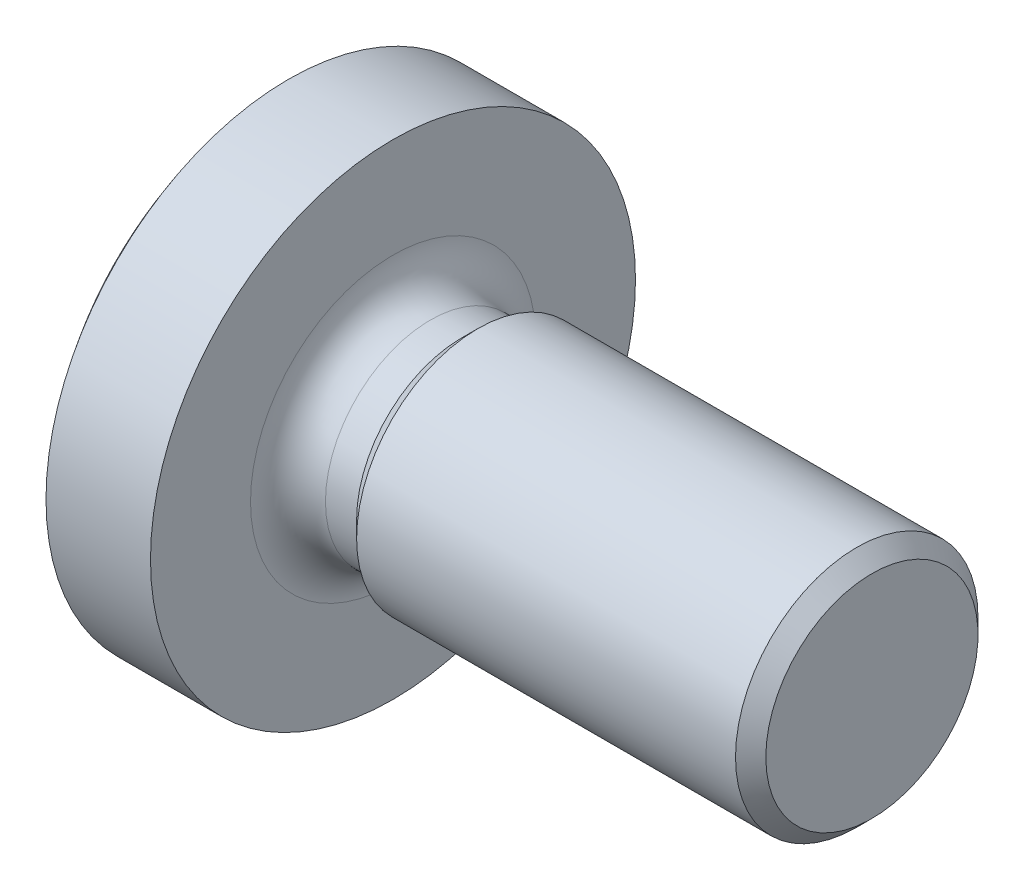
ISO-10303-21;
HEADER;
FILE_DESCRIPTION(('STEP AP214'),'2;1');
FILE_NAME('part.step','',(''),(''),'','','');
FILE_SCHEMA(('AUTOMOTIVE_DESIGN { 1 0 10303 214 1 1 1 1 }'));
ENDSEC;
DATA;
#1=APPLICATION_CONTEXT('core data for automotive mechanical design processes');
#2=APPLICATION_PROTOCOL_DEFINITION('international standard','automotive_design',2000,#1);
#3=PRODUCT_CONTEXT('',#1,'mechanical');
#4=PRODUCT('Part','Part','',(#3));
#5=PRODUCT_RELATED_PRODUCT_CATEGORY('part','',(#4));
#6=PRODUCT_DEFINITION_FORMATION('','',#4);
#7=PRODUCT_DEFINITION_CONTEXT('part definition',#1,'design');
#8=PRODUCT_DEFINITION('design','',#6,#7);
#9=PRODUCT_DEFINITION_SHAPE('','',#8);
#10=(LENGTH_UNIT() NAMED_UNIT(*) SI_UNIT(.MILLI.,.METRE.));
#11=(NAMED_UNIT(*) PLANE_ANGLE_UNIT() SI_UNIT($,.RADIAN.));
#12=(NAMED_UNIT(*) SI_UNIT($,.STERADIAN.) SOLID_ANGLE_UNIT());
#13=UNCERTAINTY_MEASURE_WITH_UNIT(LENGTH_MEASURE(1.E-05),#10,'distance_accuracy_value','');
#14=(GEOMETRIC_REPRESENTATION_CONTEXT(3) GLOBAL_UNCERTAINTY_ASSIGNED_CONTEXT((#13)) GLOBAL_UNIT_ASSIGNED_CONTEXT((#10,
#11,#12)) REPRESENTATION_CONTEXT('',''));
#15=CARTESIAN_POINT('',(0.,0.,0.));
#16=DIRECTION('',(0.,0.,1.));
#17=DIRECTION('',(1.,0.,0.));
#18=AXIS2_PLACEMENT_3D('',#15,#16,#17);
#19=CARTESIAN_POINT('',(2.4,0.,0.));
#20=DIRECTION('',(0.144306893071729,0.,-0.989532981063282));
#21=DIRECTION('',(-0.989532981063282,0.,-0.144306893071729));
#22=AXIS2_PLACEMENT_3D('',#19,#20,#21);
#23=PLANE('',#22);
#24=DIRECTION('',(-0.732931208059297,-0.671853607387689,-0.106885801175314));
#25=VECTOR('',#24,1.);
#26=CARTESIAN_POINT('',(2.4,0.,0.));
#27=LINE('',#26,#25);
#28=CARTESIAN_POINT('',(2.4,0.,0.));
#29=VERTEX_POINT('',#28);
#30=CARTESIAN_POINT('',(0.299339193338267,-1.92560573943992,-0.30634636763817));
#31=VERTEX_POINT('',#30);
#32=EDGE_CURVE('E160',#29,#31,#27,.T.);
#33=ORIENTED_EDGE('',*,*,#32,.F.);
#34=DIRECTION('',(-0.979387903800927,-0.142827402637635,-0.142827402637635));
#35=VECTOR('',#34,1.);
#36=CARTESIAN_POINT('',(2.4,0.,0.));
#37=LINE('',#36,#35);
#38=CARTESIAN_POINT('',(0.0185820115886168,-0.347290123309992,-0.347290123309993));
#39=VERTEX_POINT('',#38);
#40=EDGE_CURVE('E117',#29,#39,#37,.T.);
#41=ORIENTED_EDGE('',*,*,#40,.T.);
#42=CARTESIAN_POINT('',(6.41461963450914,0.,0.585465363365916));
#43=DIRECTION('',(0.144306893071729,0.,-0.989532981063282));
#44=DIRECTION('',(-0.989532981063282,0.,-0.144306893071729));
#45=AXIS2_PLACEMENT_3D('',#42,#43,#44);
#46=CIRCLE('',#45,6.47301633718682);
#47=EDGE_CURVE('E132',#31,#39,#46,.T.);
#48=ORIENTED_EDGE('',*,*,#47,.F.);
#49=EDGE_LOOP('',(#33,#41,#48));
#50=FACE_BOUND('',#49,.T.);
#51=ADVANCED_FACE('F37',(#50),#23,.F.);
#52=CARTESIAN_POINT('',(2.4,0.,0.));
#53=DIRECTION('',(0.144306893071729,0.,0.989532981063282));
#54=DIRECTION('',(0.989532981063282,0.,-0.144306893071729));
#55=AXIS2_PLACEMENT_3D('',#52,#53,#54);
#56=PLANE('',#55);
#57=CARTESIAN_POINT('',(6.41461963450914,0.,-0.585465363365916));
#58=DIRECTION('',(0.144306893071729,0.,0.989532981063282));
#59=DIRECTION('',(0.989532981063282,0.,-0.144306893071729));
#60=AXIS2_PLACEMENT_3D('',#57,#58,#59);
#61=CIRCLE('',#60,6.47301633718682);
#62=CARTESIAN_POINT('',(0.0185820115886177,-0.347290123309995,0.347290123309993));
#63=VERTEX_POINT('',#62);
#64=CARTESIAN_POINT('',(0.299339193338266,-1.92560573943992,0.30634636763817));
#65=VERTEX_POINT('',#64);
#66=EDGE_CURVE('E60',#63,#65,#61,.T.);
#67=ORIENTED_EDGE('',*,*,#66,.F.);
#68=DIRECTION('',(0.979387903800927,0.142827402637636,-0.142827402637635));
#69=VECTOR('',#68,1.);
#70=CARTESIAN_POINT('',(2.4,0.,0.));
#71=LINE('',#70,#69);
#72=EDGE_CURVE('E131',#63,#29,#71,.T.);
#73=ORIENTED_EDGE('',*,*,#72,.T.);
#74=DIRECTION('',(-0.732931208059297,-0.671853607387689,0.106885801175314));
#75=VECTOR('',#74,1.);
#76=CARTESIAN_POINT('',(2.4,0.,0.));
#77=LINE('',#76,#75);
#78=EDGE_CURVE('E161',#29,#65,#77,.T.);
#79=ORIENTED_EDGE('',*,*,#78,.T.);
#80=EDGE_LOOP('',(#67,#73,#79));
#81=FACE_BOUND('',#80,.T.);
#82=ADVANCED_FACE('F176',(#81),#56,.F.);
#83=CARTESIAN_POINT('',(-1.33175770411172,0.,0.));
#84=DIRECTION('',(-1.,0.,0.));
#85=DIRECTION('',(0.,0.,1.));
#86=AXIS2_PLACEMENT_3D('',#83,#84,#85);
#87=CYLINDRICAL_SURFACE('',#86,2.);
#88=CARTESIAN_POINT('',(10.75,0.,0.));
#89=DIRECTION('',(-1.,0.,0.));
#90=DIRECTION('',(0.,0.,1.));
#91=AXIS2_PLACEMENT_3D('',#88,#89,#90);
#92=CIRCLE('',#91,2.);
#93=CARTESIAN_POINT('',(10.75,0.,2.));
#94=VERTEX_POINT('',#93);
#95=EDGE_CURVE('E45',#94,#94,#92,.T.);
#96=ORIENTED_EDGE('',*,*,#95,.T.);
#97=EDGE_LOOP('',(#96));
#98=FACE_BOUND('',#97,.T.);
#99=CARTESIAN_POINT('',(4.5,0.,0.));
#100=DIRECTION('',(-1.,0.,0.));
#101=DIRECTION('',(0.,0.,1.));
#102=AXIS2_PLACEMENT_3D('',#99,#100,#101);
#103=CIRCLE('',#102,2.);
#104=CARTESIAN_POINT('',(4.5,0.,2.));
#105=VERTEX_POINT('',#104);
#106=EDGE_CURVE('E165',#105,#105,#103,.T.);
#107=ORIENTED_EDGE('',*,*,#106,.F.);
#108=EDGE_LOOP('',(#107));
#109=FACE_BOUND('',#108,.T.);
#110=ADVANCED_FACE('F209',(#98,#109),#87,.T.);
#111=CARTESIAN_POINT('',(6.5,0.,0.));
#112=DIRECTION('',(-1.,0.,0.));
#113=DIRECTION('',(0.,1.,0.));
#114=AXIS2_PLACEMENT_3D('',#111,#112,#113);
#115=SPHERICAL_SURFACE('',#114,6.5);
#116=CARTESIAN_POINT('',(4.62792452830189,0.,-2.0422641509434));
#117=DIRECTION('',(0.675724628517346,0.,0.737154140200741));
#118=DIRECTION('',(0.737154140200741,0.,-0.675724628517346));
#119=AXIS2_PLACEMENT_3D('',#116,#117,#118);
#120=CIRCLE('',#119,5.88000770118864);
#121=CARTESIAN_POINT('',(0.299339193338266,0.306346367638162,1.92560573943992));
#122=VERTEX_POINT('',#121);
#123=CARTESIAN_POINT('',(0.299339193338267,-0.306346367638176,1.92560573943992));
#124=VERTEX_POINT('',#123);
#125=EDGE_CURVE('E123',#122,#124,#120,.T.);
#126=ORIENTED_EDGE('',*,*,#125,.T.);
#127=CARTESIAN_POINT('',(6.41461963450914,0.585465363365916,0.));
#128=DIRECTION('',(0.144306893071729,-0.989532981063282,0.));
#129=DIRECTION('',(0.989532981063282,0.144306893071729,0.));
#130=AXIS2_PLACEMENT_3D('',#127,#128,#129);
#131=CIRCLE('',#130,6.47301633718682);
#132=EDGE_CURVE('E143',#124,#63,#131,.T.);
#133=ORIENTED_EDGE('',*,*,#132,.T.);
#134=ORIENTED_EDGE('',*,*,#66,.T.);
#135=CARTESIAN_POINT('',(4.62792452830189,2.0422641509434,0.));
#136=DIRECTION('',(0.675724628517346,-0.737154140200741,0.));
#137=DIRECTION('',(0.737154140200741,0.675724628517346,0.));
#138=AXIS2_PLACEMENT_3D('',#135,#136,#137);
#139=CIRCLE('',#138,5.88000770118864);
#140=EDGE_CURVE('E173',#65,#31,#139,.T.);
#141=ORIENTED_EDGE('',*,*,#140,.T.);
#142=ORIENTED_EDGE('',*,*,#47,.T.);
#143=CARTESIAN_POINT('',(0.299339193338267,-0.306346367638163,-1.92560573943992));
#144=VERTEX_POINT('',#143);
#145=EDGE_CURVE('E119',#39,#144,#131,.T.);
#146=ORIENTED_EDGE('',*,*,#145,.T.);
#147=CARTESIAN_POINT('',(4.62792452830189,0.,2.0422641509434));
#148=DIRECTION('',(0.675724628517346,0.,-0.737154140200741));
#149=DIRECTION('',(-0.737154140200741,0.,-0.675724628517346));
#150=AXIS2_PLACEMENT_3D('',#147,#148,#149);
#151=CIRCLE('',#150,5.88000770118864);
#152=CARTESIAN_POINT('',(0.299339193338266,0.306346367638176,-1.92560573943992));
#153=VERTEX_POINT('',#152);
#154=EDGE_CURVE('E111',#144,#153,#151,.T.);
#155=ORIENTED_EDGE('',*,*,#154,.T.);
#156=CARTESIAN_POINT('',(6.41461963450914,-0.585465363365916,0.));
#157=DIRECTION('',(0.144306893071729,0.989532981063282,0.));
#158=DIRECTION('',(-0.989532981063282,0.144306893071729,0.));
#159=AXIS2_PLACEMENT_3D('',#156,#157,#158);
#160=CIRCLE('',#159,6.47301633718682);
#161=CARTESIAN_POINT('',(0.0185820115886177,0.347290123309994,-0.347290123309993));
#162=VERTEX_POINT('',#161);
#163=EDGE_CURVE('E102',#153,#162,#160,.T.);
#164=ORIENTED_EDGE('',*,*,#163,.T.);
#165=CARTESIAN_POINT('',(0.299339193338267,1.92560573943992,-0.30634636763817));
#166=VERTEX_POINT('',#165);
#167=EDGE_CURVE('E151',#162,#166,#46,.T.);
#168=ORIENTED_EDGE('',*,*,#167,.T.);
#169=CARTESIAN_POINT('',(4.62792452830189,-2.0422641509434,0.));
#170=DIRECTION('',(0.675724628517346,0.737154140200741,0.));
#171=DIRECTION('',(-0.737154140200741,0.675724628517346,0.));
#172=AXIS2_PLACEMENT_3D('',#169,#170,#171);
#173=CIRCLE('',#172,5.88000770118864);
#174=CARTESIAN_POINT('',(0.299339193338266,1.92560573943992,0.306346367638169));
#175=VERTEX_POINT('',#174);
#176=EDGE_CURVE('E164',#166,#175,#173,.T.);
#177=ORIENTED_EDGE('',*,*,#176,.T.);
#178=CARTESIAN_POINT('',(0.0185820115886168,0.347290123309992,0.347290123309993));
#179=VERTEX_POINT('',#178);
#180=EDGE_CURVE('E156',#175,#179,#61,.T.);
#181=ORIENTED_EDGE('',*,*,#180,.T.);
#182=EDGE_CURVE('E52',#179,#122,#160,.T.);
#183=ORIENTED_EDGE('',*,*,#182,.T.);
#184=EDGE_LOOP('',(#126,#133,#134,#141,#142,#146,#155,#164,#168,#177,#181,#183));
#185=FACE_BOUND('',#184,.T.);
#186=CARTESIAN_POINT('',(1.3765246170202,0.,0.));
#187=DIRECTION('',(-1.,0.,0.));
#188=DIRECTION('',(0.,0.,1.));
#189=AXIS2_PLACEMENT_3D('',#186,#187,#188);
#190=CIRCLE('',#189,4.);
#191=CARTESIAN_POINT('',(1.3765246170202,0.,4.));
#192=VERTEX_POINT('',#191);
#193=EDGE_CURVE('E184',#192,#192,#190,.T.);
#194=ORIENTED_EDGE('',*,*,#193,.T.);
#195=EDGE_LOOP('',(#194));
#196=FACE_BOUND('',#195,.T.);
#197=ADVANCED_FACE('F205',(#185,#196),#115,.T.);
#198=CARTESIAN_POINT('',(-1.33175770411172,0.,0.));
#199=DIRECTION('',(-1.,0.,0.));
#200=DIRECTION('',(0.,0.,1.));
#201=AXIS2_PLACEMENT_3D('',#198,#199,#200);
#202=CYLINDRICAL_SURFACE('',#201,4.);
#203=ORIENTED_EDGE('',*,*,#193,.F.);
#204=EDGE_LOOP('',(#203));
#205=FACE_BOUND('',#204,.T.);
#206=CARTESIAN_POINT('',(3.1,0.,0.));
#207=DIRECTION('',(-1.,0.,0.));
#208=DIRECTION('',(0.,0.,1.));
#209=AXIS2_PLACEMENT_3D('',#206,#207,#208);
#210=CIRCLE('',#209,4.);
#211=CARTESIAN_POINT('',(3.1,0.,4.));
#212=VERTEX_POINT('',#211);
#213=EDGE_CURVE('E187',#212,#212,#210,.T.);
#214=ORIENTED_EDGE('',*,*,#213,.T.);
#215=EDGE_LOOP('',(#214));
#216=FACE_BOUND('',#215,.T.);
#217=ADVANCED_FACE('F208',(#205,#216),#202,.T.);
#218=CARTESIAN_POINT('',(3.1,2.35,0.));
#219=DIRECTION('',(-1.,0.,0.));
#220=DIRECTION('',(0.,0.,1.));
#221=AXIS2_PLACEMENT_3D('',#218,#219,#220);
#222=PLANE('',#221);
#223=ORIENTED_EDGE('',*,*,#213,.F.);
#224=EDGE_LOOP('',(#223));
#225=FACE_BOUND('',#224,.T.);
#226=CARTESIAN_POINT('',(3.1,0.,0.));
#227=DIRECTION('',(-1.,0.,0.));
#228=DIRECTION('',(0.,0.,1.));
#229=AXIS2_PLACEMENT_3D('',#226,#227,#228);
#230=CIRCLE('',#229,2.35);
#231=CARTESIAN_POINT('',(3.1,0.,2.35));
#232=VERTEX_POINT('',#231);
#233=EDGE_CURVE('E191',#232,#232,#230,.T.);
#234=ORIENTED_EDGE('',*,*,#233,.T.);
#235=EDGE_LOOP('',(#234));
#236=FACE_BOUND('',#235,.T.);
#237=ADVANCED_FACE('F214',(#225,#236),#222,.F.);
#238=CARTESIAN_POINT('',(3.718,0.,0.));
#239=DIRECTION('',(-1.,0.,0.));
#240=DIRECTION('',(0.,0.,1.));
#241=AXIS2_PLACEMENT_3D('',#238,#239,#240);
#242=TOROIDAL_SURFACE('',#241,2.35,0.618);
#243=ORIENTED_EDGE('',*,*,#233,.F.);
#244=EDGE_LOOP('',(#243));
#245=FACE_BOUND('',#244,.T.);
#246=CARTESIAN_POINT('',(3.718,0.,0.));
#247=DIRECTION('',(-1.,0.,0.));
#248=DIRECTION('',(0.,0.,1.));
#249=AXIS2_PLACEMENT_3D('',#246,#247,#248);
#250=CIRCLE('',#249,1.732);
#251=CARTESIAN_POINT('',(3.718,0.,1.732));
#252=VERTEX_POINT('',#251);
#253=EDGE_CURVE('E194',#252,#252,#250,.T.);
#254=ORIENTED_EDGE('',*,*,#253,.T.);
#255=EDGE_LOOP('',(#254));
#256=FACE_BOUND('',#255,.T.);
#257=ADVANCED_FACE('F220',(#245,#256),#242,.F.);
#258=CARTESIAN_POINT('',(-1.33175770411172,0.,0.));
#259=DIRECTION('',(-1.,0.,0.));
#260=DIRECTION('',(0.,0.,1.));
#261=AXIS2_PLACEMENT_3D('',#258,#259,#260);
#262=CYLINDRICAL_SURFACE('',#261,1.732);
#263=ORIENTED_EDGE('',*,*,#253,.F.);
#264=EDGE_LOOP('',(#263));
#265=FACE_BOUND('',#264,.T.);
#266=CARTESIAN_POINT('',(4.232,0.,0.));
#267=DIRECTION('',(-1.,0.,0.));
#268=DIRECTION('',(0.,0.,1.));
#269=AXIS2_PLACEMENT_3D('',#266,#267,#268);
#270=CIRCLE('',#269,1.732);
#271=CARTESIAN_POINT('',(4.232,0.,1.732));
#272=VERTEX_POINT('',#271);
#273=EDGE_CURVE('E197',#272,#272,#270,.T.);
#274=ORIENTED_EDGE('',*,*,#273,.T.);
#275=EDGE_LOOP('',(#274));
#276=FACE_BOUND('',#275,.T.);
#277=ADVANCED_FACE('F226',(#265,#276),#262,.T.);
#278=CARTESIAN_POINT('',(4.5,0.,0.));
#279=DIRECTION('',(1.,0.,0.));
#280=DIRECTION('',(0.,0.,-1.));
#281=AXIS2_PLACEMENT_3D('',#278,#279,#280);
#282=CONICAL_SURFACE('',#281,2.,0.785398163397443);
#283=ORIENTED_EDGE('',*,*,#273,.F.);
#284=EDGE_LOOP('',(#283));
#285=FACE_BOUND('',#284,.T.);
#286=ORIENTED_EDGE('',*,*,#106,.T.);
#287=EDGE_LOOP('',(#286));
#288=FACE_BOUND('',#287,.T.);
#289=ADVANCED_FACE('F232',(#285,#288),#282,.T.);
#290=ORIENTED_EDGE('',*,*,#167,.F.);
#291=DIRECTION('',(0.979387903800927,-0.142827402637636,0.142827402637635));
#292=VECTOR('',#291,1.);
#293=CARTESIAN_POINT('',(2.4,0.,0.));
#294=LINE('',#293,#292);
#295=EDGE_CURVE('E100',#162,#29,#294,.T.);
#296=ORIENTED_EDGE('',*,*,#295,.T.);
#297=DIRECTION('',(-0.732931208059297,0.671853607387689,-0.106885801175314));
#298=VECTOR('',#297,1.);
#299=CARTESIAN_POINT('',(2.4,0.,0.));
#300=LINE('',#299,#298);
#301=EDGE_CURVE('E150',#29,#166,#300,.T.);
#302=ORIENTED_EDGE('',*,*,#301,.T.);
#303=EDGE_LOOP('',(#290,#296,#302));
#304=FACE_BOUND('',#303,.T.);
#305=ADVANCED_FACE('F148',(#304),#23,.F.);
#306=CARTESIAN_POINT('',(0.,2.2,-0.35));
#307=DIRECTION('',(0.675724628517346,0.737154140200741,0.));
#308=DIRECTION('',(-0.737154140200741,0.675724628517346,0.));
#309=AXIS2_PLACEMENT_3D('',#306,#307,#308);
#310=PLANE('',#309);
#311=ORIENTED_EDGE('',*,*,#301,.F.);
#312=DIRECTION('',(-0.732931208059297,0.671853607387689,0.106885801175314));
#313=VECTOR('',#312,1.);
#314=CARTESIAN_POINT('',(2.4,0.,0.));
#315=LINE('',#314,#313);
#316=EDGE_CURVE('E154',#29,#175,#315,.T.);
#317=ORIENTED_EDGE('',*,*,#316,.T.);
#318=ORIENTED_EDGE('',*,*,#176,.F.);
#319=EDGE_LOOP('',(#311,#317,#318));
#320=FACE_BOUND('',#319,.T.);
#321=ADVANCED_FACE('F163',(#320),#310,.F.);
#322=CARTESIAN_POINT('',(0.,-2.2,0.35));
#323=DIRECTION('',(0.675724628517346,-0.737154140200741,0.));
#324=DIRECTION('',(0.737154140200741,0.675724628517346,0.));
#325=AXIS2_PLACEMENT_3D('',#322,#323,#324);
#326=PLANE('',#325);
#327=ORIENTED_EDGE('',*,*,#78,.F.);
#328=ORIENTED_EDGE('',*,*,#32,.T.);
#329=ORIENTED_EDGE('',*,*,#140,.F.);
#330=EDGE_LOOP('',(#327,#328,#329));
#331=FACE_BOUND('',#330,.T.);
#332=ADVANCED_FACE('F172',(#331),#326,.F.);
#333=ORIENTED_EDGE('',*,*,#316,.F.);
#334=DIRECTION('',(-0.979387903800927,0.142827402637635,0.142827402637635));
#335=VECTOR('',#334,1.);
#336=CARTESIAN_POINT('',(2.4,0.,0.));
#337=LINE('',#336,#335);
#338=EDGE_CURVE('E125',#29,#179,#337,.T.);
#339=ORIENTED_EDGE('',*,*,#338,.T.);
#340=ORIENTED_EDGE('',*,*,#180,.F.);
#341=EDGE_LOOP('',(#333,#339,#340));
#342=FACE_BOUND('',#341,.T.);
#343=ADVANCED_FACE('F155',(#342),#56,.F.);
#344=CARTESIAN_POINT('',(2.4,0.,0.));
#345=DIRECTION('',(0.144306893071729,-0.989532981063282,0.));
#346=DIRECTION('',(-0.989532981063282,-0.144306893071729,0.));
#347=AXIS2_PLACEMENT_3D('',#344,#345,#346);
#348=PLANE('',#347);
#349=DIRECTION('',(-0.732931208059297,-0.106885801175317,0.671853607387689));
#350=VECTOR('',#349,1.);
#351=CARTESIAN_POINT('',(2.4,0.,0.));
#352=LINE('',#351,#350);
#353=EDGE_CURVE('E114',#29,#124,#352,.T.);
#354=ORIENTED_EDGE('',*,*,#353,.F.);
#355=ORIENTED_EDGE('',*,*,#72,.F.);
#356=ORIENTED_EDGE('',*,*,#132,.F.);
#357=EDGE_LOOP('',(#354,#355,#356));
#358=FACE_BOUND('',#357,.T.);
#359=ADVANCED_FACE('F141',(#358),#348,.F.);
#360=CARTESIAN_POINT('',(2.4,0.,0.));
#361=DIRECTION('',(0.144306893071729,0.989532981063282,0.));
#362=DIRECTION('',(0.989532981063282,-0.144306893071729,0.));
#363=AXIS2_PLACEMENT_3D('',#360,#361,#362);
#364=PLANE('',#363);
#365=ORIENTED_EDGE('',*,*,#338,.F.);
#366=DIRECTION('',(-0.732931208059297,0.106885801175312,0.671853607387689));
#367=VECTOR('',#366,1.);
#368=CARTESIAN_POINT('',(2.4,0.,0.));
#369=LINE('',#368,#367);
#370=EDGE_CURVE('E105',#29,#122,#369,.T.);
#371=ORIENTED_EDGE('',*,*,#370,.T.);
#372=ORIENTED_EDGE('',*,*,#182,.F.);
#373=EDGE_LOOP('',(#365,#371,#372));
#374=FACE_BOUND('',#373,.T.);
#375=ADVANCED_FACE('F127',(#374),#364,.F.);
#376=CARTESIAN_POINT('',(0.,-0.350000000000008,2.2));
#377=DIRECTION('',(0.675724628517346,0.,0.737154140200741));
#378=DIRECTION('',(-0.737154140200741,0.,0.675724628517346));
#379=AXIS2_PLACEMENT_3D('',#376,#377,#378);
#380=PLANE('',#379);
#381=ORIENTED_EDGE('',*,*,#370,.F.);
#382=ORIENTED_EDGE('',*,*,#353,.T.);
#383=ORIENTED_EDGE('',*,*,#125,.F.);
#384=EDGE_LOOP('',(#381,#382,#383));
#385=FACE_BOUND('',#384,.T.);
#386=ADVANCED_FACE('F137',(#385),#380,.F.);
#387=ORIENTED_EDGE('',*,*,#40,.F.);
#388=DIRECTION('',(-0.732931208059297,-0.106885801175312,-0.671853607387689));
#389=VECTOR('',#388,1.);
#390=CARTESIAN_POINT('',(2.4,0.,0.));
#391=LINE('',#390,#389);
#392=EDGE_CURVE('E108',#29,#144,#391,.T.);
#393=ORIENTED_EDGE('',*,*,#392,.T.);
#394=ORIENTED_EDGE('',*,*,#145,.F.);
#395=EDGE_LOOP('',(#387,#393,#394));
#396=FACE_BOUND('',#395,.T.);
#397=ADVANCED_FACE('F118',(#396),#348,.F.);
#398=CARTESIAN_POINT('',(0.,0.350000000000008,-2.2));
#399=DIRECTION('',(0.675724628517346,0.,-0.737154140200741));
#400=DIRECTION('',(0.737154140200741,0.,0.675724628517346));
#401=AXIS2_PLACEMENT_3D('',#398,#399,#400);
#402=PLANE('',#401);
#403=ORIENTED_EDGE('',*,*,#392,.F.);
#404=DIRECTION('',(-0.732931208059297,0.106885801175317,-0.671853607387689));
#405=VECTOR('',#404,1.);
#406=CARTESIAN_POINT('',(2.4,0.,0.));
#407=LINE('',#406,#405);
#408=EDGE_CURVE('E96',#29,#153,#407,.T.);
#409=ORIENTED_EDGE('',*,*,#408,.T.);
#410=ORIENTED_EDGE('',*,*,#154,.F.);
#411=EDGE_LOOP('',(#403,#409,#410));
#412=FACE_BOUND('',#411,.T.);
#413=ADVANCED_FACE('F110',(#412),#402,.F.);
#414=ORIENTED_EDGE('',*,*,#408,.F.);
#415=ORIENTED_EDGE('',*,*,#295,.F.);
#416=ORIENTED_EDGE('',*,*,#163,.F.);
#417=EDGE_LOOP('',(#414,#415,#416));
#418=FACE_BOUND('',#417,.T.);
#419=ADVANCED_FACE('F98',(#418),#364,.F.);
#420=CARTESIAN_POINT('',(11.,-5.,-2.99029308376081));
#421=DIRECTION('',(-1.,0.,0.));
#422=DIRECTION('',(0.,0.,1.));
#423=AXIS2_PLACEMENT_3D('',#420,#421,#422);
#424=PLANE('',#423);
#425=CARTESIAN_POINT('',(11.,0.,0.));
#426=DIRECTION('',(-1.,0.,0.));
#427=DIRECTION('',(0.,0.,1.));
#428=AXIS2_PLACEMENT_3D('',#425,#426,#427);
#429=CIRCLE('',#428,1.74999999999999);
#430=CARTESIAN_POINT('',(11.,0.,1.74999999999999));
#431=VERTEX_POINT('',#430);
#432=EDGE_CURVE('E11',#431,#431,#429,.F.);
#433=ORIENTED_EDGE('',*,*,#432,.T.);
#434=EDGE_LOOP('',(#433));
#435=FACE_BOUND('',#434,.T.);
#436=ADVANCED_FACE('F371',(#435),#424,.F.);
#437=CARTESIAN_POINT('',(10.75,0.,0.));
#438=DIRECTION('',(-1.,0.,0.));
#439=DIRECTION('',(0.,0.,1.));
#440=AXIS2_PLACEMENT_3D('',#437,#438,#439);
#441=CONICAL_SURFACE('',#440,2.,0.785398163397453);
#442=ORIENTED_EDGE('',*,*,#432,.F.);
#443=EDGE_LOOP('',(#442));
#444=FACE_BOUND('',#443,.T.);
#445=ORIENTED_EDGE('',*,*,#95,.F.);
#446=EDGE_LOOP('',(#445));
#447=FACE_BOUND('',#446,.T.);
#448=ADVANCED_FACE('F39',(#444,#447),#441,.T.);
#449=CLOSED_SHELL('',(#51,#82,#110,#197,#217,#237,#257,#277,#289,#305,#321,#332,#343,#359,#375,
#386,#397,#413,#419,#436,#448));
#450=MANIFOLD_SOLID_BREP('B2',#449);
#451=ADVANCED_BREP_SHAPE_REPRESENTATION('',(#18,#450),#14);
#452=SHAPE_DEFINITION_REPRESENTATION(#9,#451);
ENDSEC;
END-ISO-10303-21;
